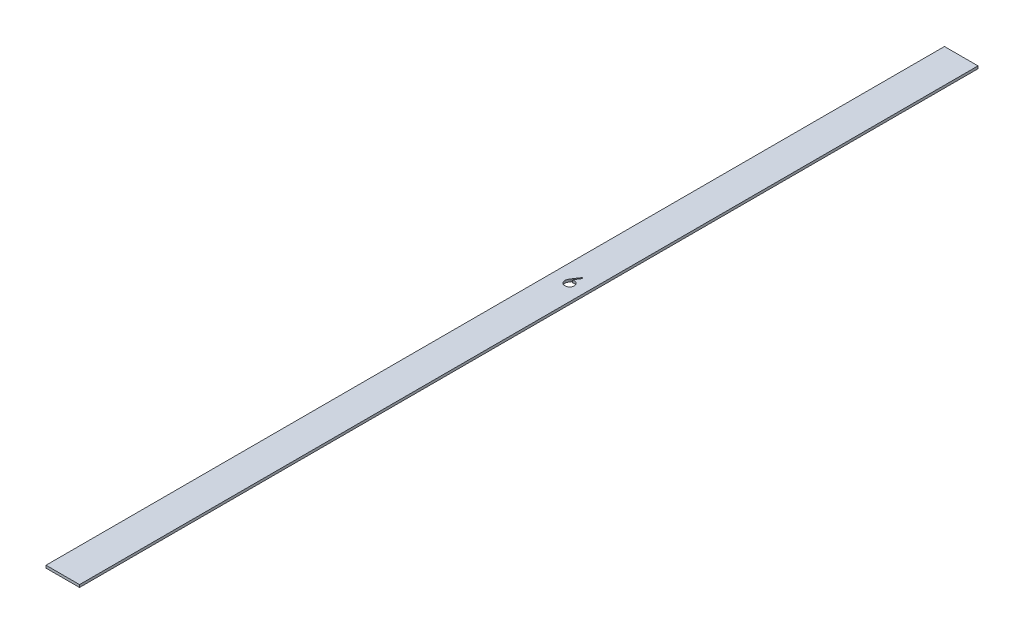
ISO-10303-21;
HEADER;
FILE_DESCRIPTION(('STEP AP214'),'2;1');
FILE_NAME('part.step','',(''),(''),'','','');
FILE_SCHEMA(('AUTOMOTIVE_DESIGN { 1 0 10303 214 1 1 1 1 }'));
ENDSEC;
DATA;
#1=APPLICATION_CONTEXT('core data for automotive mechanical design processes');
#2=APPLICATION_PROTOCOL_DEFINITION('international standard','automotive_design',2000,#1);
#3=PRODUCT_CONTEXT('',#1,'mechanical');
#4=PRODUCT('Part','Part','',(#3));
#5=PRODUCT_RELATED_PRODUCT_CATEGORY('part','',(#4));
#6=PRODUCT_DEFINITION_FORMATION('','',#4);
#7=PRODUCT_DEFINITION_CONTEXT('part definition',#1,'design');
#8=PRODUCT_DEFINITION('design','',#6,#7);
#9=PRODUCT_DEFINITION_SHAPE('','',#8);
#10=(LENGTH_UNIT() NAMED_UNIT(*) SI_UNIT(.MILLI.,.METRE.));
#11=(NAMED_UNIT(*) PLANE_ANGLE_UNIT() SI_UNIT($,.RADIAN.));
#12=(NAMED_UNIT(*) SI_UNIT($,.STERADIAN.) SOLID_ANGLE_UNIT());
#13=UNCERTAINTY_MEASURE_WITH_UNIT(LENGTH_MEASURE(1.E-05),#10,'distance_accuracy_value','');
#14=(GEOMETRIC_REPRESENTATION_CONTEXT(3) GLOBAL_UNCERTAINTY_ASSIGNED_CONTEXT((#13)) GLOBAL_UNIT_ASSIGNED_CONTEXT((#10,
#11,#12)) REPRESENTATION_CONTEXT('',''));
#15=CARTESIAN_POINT('',(0.,0.,0.));
#16=DIRECTION('',(0.,0.,1.));
#17=DIRECTION('',(1.,0.,0.));
#18=AXIS2_PLACEMENT_3D('',#15,#16,#17);
#19=CARTESIAN_POINT('',(24.9714082392186,-200.,-1329.57777919702));
#20=CARTESIAN_POINT('',(24.7150676256666,-200.,-1329.58609700256));
#21=CARTESIAN_POINT('',(24.2073017519402,-200.,-1329.60257311902));
#22=CARTESIAN_POINT('',(23.4603632575903,-200.,-1329.74934486659));
#23=CARTESIAN_POINT('',(22.7426516917751,-200.,-1329.98723638309));
#24=CARTESIAN_POINT('',(22.0591954899762,-200.,-1330.31497409916));
#25=CARTESIAN_POINT('',(21.42607901104,-200.,-1330.72894629066));
#26=CARTESIAN_POINT('',(20.859664618457,-200.,-1331.22730669565));
#27=CARTESIAN_POINT('',(20.3627765312167,-200.,-1331.7994024984));
#28=CARTESIAN_POINT('',(19.9492575230081,-200.,-1332.44514495998));
#29=CARTESIAN_POINT('',(19.6212778534097,-200.,-1333.13905458583));
#30=CARTESIAN_POINT('',(19.3753155467053,-200.,-1333.86261253703));
#31=CARTESIAN_POINT('',(19.2316445656685,-200.,-1334.61318243757));
#32=CARTESIAN_POINT('',(19.2115682776947,-200.,-1335.12198692371));
#33=CARTESIAN_POINT('',(19.2014563161417,-200.,-1335.37825996625));
#34=B_SPLINE_CURVE_WITH_KNOTS('',3,(#19,#20,#21,#22,#23,#24,#25,#26,#27,#28,#29,#30,#31,#32,
#33),.UNSPECIFIED.,.F.,.F.,(4,1,1,1,1,1,1,1,1,1,1,1,4),(0.,0.084334721992627,0.167052318416074,
0.249566077240966,0.332740481801847,0.415914886362728,0.497828009539996,0.580372588608052,
0.664600121056504,0.749466693112618,0.832510233940141,0.915639281668174,1.),.UNSPECIFIED.);
#35=DIRECTION('',(0.,1.,0.));
#36=VECTOR('',#35,1.);
#37=SURFACE_OF_LINEAR_EXTRUSION('',#34,#36);
#38=DIRECTION('',(0.,-1.,0.));
#39=VECTOR('',#38,1.);
#40=CARTESIAN_POINT('',(19.2014563161417,-200.,-1335.37825996625));
#41=LINE('',#40,#39);
#42=CARTESIAN_POINT('',(19.2014563161417,-196.825,-1335.37825996625));
#43=VERTEX_POINT('',#42);
#44=CARTESIAN_POINT('',(19.2014563161417,-200.,-1335.37825996625));
#45=VERTEX_POINT('',#44);
#46=EDGE_CURVE('E219',#43,#45,#41,.T.);
#47=ORIENTED_EDGE('',*,*,#46,.F.);
#48=CARTESIAN_POINT('',(24.9714082392186,-196.825,-1329.57777919702));
#49=CARTESIAN_POINT('',(24.7150676256666,-196.825,-1329.58609700256));
#50=CARTESIAN_POINT('',(24.2073017519402,-196.825,-1329.60257311902));
#51=CARTESIAN_POINT('',(23.4603632575903,-196.825,-1329.74934486659));
#52=CARTESIAN_POINT('',(22.7426516917751,-196.825,-1329.98723638309));
#53=CARTESIAN_POINT('',(22.0591954899762,-196.825,-1330.31497409916));
#54=CARTESIAN_POINT('',(21.42607901104,-196.825,-1330.72894629066));
#55=CARTESIAN_POINT('',(20.859664618457,-196.825,-1331.22730669565));
#56=CARTESIAN_POINT('',(20.3627765312167,-196.825,-1331.7994024984));
#57=CARTESIAN_POINT('',(19.9492575230081,-196.825,-1332.44514495998));
#58=CARTESIAN_POINT('',(19.6212778534097,-196.825,-1333.13905458583));
#59=CARTESIAN_POINT('',(19.3753155467053,-196.825,-1333.86261253703));
#60=CARTESIAN_POINT('',(19.2316445656685,-196.825,-1334.61318243757));
#61=CARTESIAN_POINT('',(19.2115682776947,-196.825,-1335.12198692371));
#62=CARTESIAN_POINT('',(19.2014563161417,-196.825,-1335.37825996625));
#63=B_SPLINE_CURVE_WITH_KNOTS('',3,(#48,#49,#50,#51,#52,#53,#54,#55,#56,#57,#58,#59,#60,#61,
#62),.UNSPECIFIED.,.F.,.F.,(4,1,1,1,1,1,1,1,1,1,1,1,4),(0.,0.084334721992627,0.167052318416074,
0.249566077240966,0.332740481801847,0.415914886362728,0.497828009539996,0.580372588608052,
0.664600121056504,0.749466693112618,0.832510233940141,0.915639281668174,1.),.UNSPECIFIED.);
#64=CARTESIAN_POINT('',(24.9714082392186,-196.825,-1329.57777919702));
#65=VERTEX_POINT('',#64);
#66=EDGE_CURVE('E131',#65,#43,#63,.T.);
#67=ORIENTED_EDGE('',*,*,#66,.F.);
#68=DIRECTION('',(0.,-1.,0.));
#69=VECTOR('',#68,1.);
#70=CARTESIAN_POINT('',(24.9714082392186,-200.,-1329.57777919702));
#71=LINE('',#70,#69);
#72=CARTESIAN_POINT('',(24.9714082392186,-200.,-1329.57777919702));
#73=VERTEX_POINT('',#72);
#74=EDGE_CURVE('E215',#65,#73,#71,.T.);
#75=ORIENTED_EDGE('',*,*,#74,.T.);
#76=EDGE_CURVE('E288',#73,#45,#34,.T.);
#77=ORIENTED_EDGE('',*,*,#76,.T.);
#78=EDGE_LOOP('',(#47,#67,#75,#77));
#79=FACE_BOUND('',#78,.T.);
#80=ADVANCED_FACE('F48',(#79),#37,.T.);
#81=CARTESIAN_POINT('',(30.9245332392186,-200.,-1335.41260491817));
#82=CARTESIAN_POINT('',(30.9167874826346,-200.,-1335.14601538669));
#83=CARTESIAN_POINT('',(30.9015456667687,-200.,-1334.62143027915));
#84=CARTESIAN_POINT('',(30.7496692912848,-200.,-1333.85737992));
#85=CARTESIAN_POINT('',(30.5136689391165,-200.,-1333.1294929426));
#86=CARTESIAN_POINT('',(30.1763341059508,-200.,-1332.4493906813));
#87=CARTESIAN_POINT('',(29.7573299928536,-200.,-1331.81800526688));
#88=CARTESIAN_POINT('',(29.2463676670475,-200.,-1331.25855866223));
#89=CARTESIAN_POINT('',(28.6615681091149,-200.,-1330.75961174483));
#90=CARTESIAN_POINT('',(28.0003328218781,-200.,-1330.34238071742));
#91=CARTESIAN_POINT('',(27.2887175457591,-200.,-1330.00164125406));
#92=CARTESIAN_POINT('',(26.5411302455468,-200.,-1329.75690186501));
#93=CARTESIAN_POINT('',(25.7648310633292,-200.,-1329.60622469589));
#94=CARTESIAN_POINT('',(25.2379374109179,-200.,-1329.58733470137));
#95=CARTESIAN_POINT('',(24.9714082392186,-200.,-1329.57777919702));
#96=B_SPLINE_CURVE_WITH_KNOTS('',3,(#81,#82,#83,#84,#85,#86,#87,#88,#89,#90,#91,#92,#93,#94,
#95),.UNSPECIFIED.,.F.,.F.,(4,1,1,1,1,1,1,1,1,1,1,1,4),(0.,0.085947943144129,0.169125211880691,
0.250399107186049,0.332289736138836,0.413364287915881,0.494172283371189,0.576021735386637,
0.660756969254007,0.745783125913744,0.830043592975224,0.914027545820683,1.),.UNSPECIFIED.);
#97=DIRECTION('',(0.,1.,0.));
#98=VECTOR('',#97,1.);
#99=SURFACE_OF_LINEAR_EXTRUSION('',#96,#98);
#100=ORIENTED_EDGE('',*,*,#74,.F.);
#101=CARTESIAN_POINT('',(30.9245332392186,-196.825,-1335.41260491817));
#102=CARTESIAN_POINT('',(30.9167874826346,-196.825,-1335.14601538669));
#103=CARTESIAN_POINT('',(30.9015456667687,-196.825,-1334.62143027915));
#104=CARTESIAN_POINT('',(30.7496692912848,-196.825,-1333.85737992));
#105=CARTESIAN_POINT('',(30.5136689391165,-196.825,-1333.1294929426));
#106=CARTESIAN_POINT('',(30.1763341059508,-196.825,-1332.4493906813));
#107=CARTESIAN_POINT('',(29.7573299928536,-196.825,-1331.81800526688));
#108=CARTESIAN_POINT('',(29.2463676670475,-196.825,-1331.25855866223));
#109=CARTESIAN_POINT('',(28.6615681091149,-196.825,-1330.75961174483));
#110=CARTESIAN_POINT('',(28.0003328218781,-196.825,-1330.34238071742));
#111=CARTESIAN_POINT('',(27.2887175457591,-196.825,-1330.00164125406));
#112=CARTESIAN_POINT('',(26.5411302455468,-196.825,-1329.75690186501));
#113=CARTESIAN_POINT('',(25.7648310633292,-196.825,-1329.60622469589));
#114=CARTESIAN_POINT('',(25.2379374109179,-196.825,-1329.58733470137));
#115=CARTESIAN_POINT('',(24.9714082392186,-196.825,-1329.57777919702));
#116=B_SPLINE_CURVE_WITH_KNOTS('',3,(#101,#102,#103,#104,#105,#106,#107,#108,#109,#110,#111,
#112,#113,#114,#115),.UNSPECIFIED.,.F.,.F.,(4,1,1,1,1,1,1,1,1,1,1,1,4),(0.,0.085947943144129,
0.169125211880691,0.250399107186049,0.332289736138836,0.413364287915881,0.494172283371189,
0.576021735386637,0.660756969254007,0.745783125913744,0.830043592975224,0.914027545820683,1.),.UNSPECIFIED.);
#117=CARTESIAN_POINT('',(30.9245332392186,-196.825,-1335.41260491817));
#118=VERTEX_POINT('',#117);
#119=EDGE_CURVE('E167',#118,#65,#116,.T.);
#120=ORIENTED_EDGE('',*,*,#119,.F.);
#121=DIRECTION('',(0.,-1.,0.));
#122=VECTOR('',#121,1.);
#123=CARTESIAN_POINT('',(30.9245332392186,-200.,-1335.41260491817));
#124=LINE('',#123,#122);
#125=CARTESIAN_POINT('',(30.9245332392186,-200.,-1335.41260491817));
#126=VERTEX_POINT('',#125);
#127=EDGE_CURVE('E211',#118,#126,#124,.T.);
#128=ORIENTED_EDGE('',*,*,#127,.T.);
#129=EDGE_CURVE('E282',#126,#73,#96,.T.);
#130=ORIENTED_EDGE('',*,*,#129,.T.);
#131=EDGE_LOOP('',(#100,#120,#128,#130));
#132=FACE_BOUND('',#131,.T.);
#133=ADVANCED_FACE('F277',(#132),#99,.T.);
#134=CARTESIAN_POINT('',(25.2728805949879,-200.,-1341.05662535086));
#135=CARTESIAN_POINT('',(25.466496610755,-200.,-1341.05142137149));
#136=CARTESIAN_POINT('',(25.8476239760938,-200.,-1341.04117749296));
#137=CARTESIAN_POINT('',(26.4071867136408,-200.,-1340.96234396276));
#138=CARTESIAN_POINT('',(26.9448807794377,-200.,-1340.83811013929));
#139=CARTESIAN_POINT('',(27.4584775547135,-200.,-1340.65701400335));
#140=CARTESIAN_POINT('',(27.9498204988349,-200.,-1340.42567976032));
#141=CARTESIAN_POINT('',(28.4217292547971,-200.,-1340.14842676636));
#142=CARTESIAN_POINT('',(28.8653330526609,-200.,-1339.81093870613));
#143=CARTESIAN_POINT('',(29.2863444709428,-200.,-1339.4339394468));
#144=CARTESIAN_POINT('',(29.6685805296102,-200.,-1339.01637985976));
#145=CARTESIAN_POINT('',(30.0069959177161,-200.,-1338.57332401283));
#146=CARTESIAN_POINT('',(30.2912588841547,-200.,-1338.1052335034));
#147=CARTESIAN_POINT('',(30.5218940860855,-200.,-1337.61234541882));
#148=CARTESIAN_POINT('',(30.7009906395968,-200.,-1337.09541953464));
#149=CARTESIAN_POINT('',(30.8315519647627,-200.,-1336.55511723256));
#150=CARTESIAN_POINT('',(30.908729462825,-200.,-1335.9910659379));
#151=CARTESIAN_POINT('',(30.9192096337171,-200.,-1335.60746329824));
#152=CARTESIAN_POINT('',(30.9245332392186,-200.,-1335.41260491817));
#153=B_SPLINE_CURVE_WITH_KNOTS('',3,(#134,#135,#136,#137,#138,#139,#140,#141,#142,#143,#144,
#145,#146,#147,#148,#149,#150,#151,#152),.UNSPECIFIED.,.F.,.F.,(4,1,1,1,1,1,1,1,1,1,1,1,1,1,1,1,
4),(0.,0.0652308037420294,0.128404896003223,0.190067071596478,0.25094336576828,
0.311545832852143,0.37286280215683,0.435023673856238,0.499071724707044,0.563091075049662,
0.625510106330375,0.686680035929649,0.747282503013513,0.808563495215959,0.870742103515987,
0.934340951505912,1.),.UNSPECIFIED.);
#154=DIRECTION('',(0.,1.,0.));
#155=VECTOR('',#154,1.);
#156=SURFACE_OF_LINEAR_EXTRUSION('',#153,#155);
#157=ORIENTED_EDGE('',*,*,#127,.F.);
#158=CARTESIAN_POINT('',(25.2728805949879,-196.825,-1341.05662535086));
#159=CARTESIAN_POINT('',(25.466496610755,-196.825,-1341.05142137149));
#160=CARTESIAN_POINT('',(25.8476239760938,-196.825,-1341.04117749296));
#161=CARTESIAN_POINT('',(26.4071867136408,-196.825,-1340.96234396276));
#162=CARTESIAN_POINT('',(26.9448807794377,-196.825,-1340.83811013929));
#163=CARTESIAN_POINT('',(27.4584775547135,-196.825,-1340.65701400335));
#164=CARTESIAN_POINT('',(27.9498204988349,-196.825,-1340.42567976032));
#165=CARTESIAN_POINT('',(28.4217292547971,-196.825,-1340.14842676636));
#166=CARTESIAN_POINT('',(28.8653330526609,-196.825,-1339.81093870613));
#167=CARTESIAN_POINT('',(29.2863444709428,-196.825,-1339.4339394468));
#168=CARTESIAN_POINT('',(29.6685805296102,-196.825,-1339.01637985976));
#169=CARTESIAN_POINT('',(30.0069959177161,-196.825,-1338.57332401283));
#170=CARTESIAN_POINT('',(30.2912588841547,-196.825,-1338.1052335034));
#171=CARTESIAN_POINT('',(30.5218940860855,-196.825,-1337.61234541882));
#172=CARTESIAN_POINT('',(30.7009906395968,-196.825,-1337.09541953464));
#173=CARTESIAN_POINT('',(30.8315519647627,-196.825,-1336.55511723256));
#174=CARTESIAN_POINT('',(30.908729462825,-196.825,-1335.9910659379));
#175=CARTESIAN_POINT('',(30.9192096337171,-196.825,-1335.60746329824));
#176=CARTESIAN_POINT('',(30.9245332392186,-196.825,-1335.41260491817));
#177=B_SPLINE_CURVE_WITH_KNOTS('',3,(#158,#159,#160,#161,#162,#163,#164,#165,#166,#167,#168,
#169,#170,#171,#172,#173,#174,#175,#176),.UNSPECIFIED.,.F.,.F.,(4,1,1,1,1,1,1,1,1,1,1,1,1,1,1,1,
4),(0.,0.0652308037420294,0.128404896003223,0.190067071596478,0.25094336576828,
0.311545832852143,0.37286280215683,0.435023673856238,0.499071724707044,0.563091075049662,
0.625510106330375,0.686680035929649,0.747282503013513,0.808563495215959,0.870742103515987,
0.934340951505912,1.),.UNSPECIFIED.);
#178=CARTESIAN_POINT('',(25.2728805949879,-196.825,-1341.05662535086));
#179=VERTEX_POINT('',#178);
#180=EDGE_CURVE('E158',#179,#118,#177,.T.);
#181=ORIENTED_EDGE('',*,*,#180,.F.);
#182=DIRECTION('',(0.,-1.,0.));
#183=VECTOR('',#182,1.);
#184=CARTESIAN_POINT('',(25.2728805949879,-200.,-1341.05662535086));
#185=LINE('',#184,#183);
#186=CARTESIAN_POINT('',(25.2728805949879,-200.,-1341.05662535086));
#187=VERTEX_POINT('',#186);
#188=EDGE_CURVE('E207',#179,#187,#185,.T.);
#189=ORIENTED_EDGE('',*,*,#188,.T.);
#190=EDGE_CURVE('E258',#187,#126,#153,.T.);
#191=ORIENTED_EDGE('',*,*,#190,.T.);
#192=EDGE_LOOP('',(#157,#181,#189,#191));
#193=FACE_BOUND('',#192,.T.);
#194=ADVANCED_FACE('F272',(#193),#156,.T.);
#195=CARTESIAN_POINT('',(23.2999539122956,-200.,-1340.87345227394));
#196=CARTESIAN_POINT('',(23.635072134162,-200.,-1340.9268677155));
#197=CARTESIAN_POINT('',(24.2887581164709,-200.,-1341.03106057374));
#198=CARTESIAN_POINT('',(24.9504239355822,-200.,-1341.04824881968));
#199=CARTESIAN_POINT('',(25.2728805949879,-200.,-1341.05662535086));
#200=B_SPLINE_CURVE_WITH_KNOTS('',3,(#195,#196,#197,#198,#199),.UNSPECIFIED.,.F.,.F.,(4,1,4),
(0.,0.512659336341781,1.),.UNSPECIFIED.);
#201=DIRECTION('',(0.,1.,0.));
#202=VECTOR('',#201,1.);
#203=SURFACE_OF_LINEAR_EXTRUSION('',#200,#202);
#204=ORIENTED_EDGE('',*,*,#188,.F.);
#205=CARTESIAN_POINT('',(23.2999539122956,-196.825,-1340.87345227394));
#206=CARTESIAN_POINT('',(23.635072134162,-196.825,-1340.9268677155));
#207=CARTESIAN_POINT('',(24.2887581164709,-196.825,-1341.03106057374));
#208=CARTESIAN_POINT('',(24.9504239355822,-196.825,-1341.04824881968));
#209=CARTESIAN_POINT('',(25.2728805949879,-196.825,-1341.05662535086));
#210=B_SPLINE_CURVE_WITH_KNOTS('',3,(#205,#206,#207,#208,#209),.UNSPECIFIED.,.F.,.F.,(4,1,4),
(0.,0.512659336341781,1.),.UNSPECIFIED.);
#211=CARTESIAN_POINT('',(23.2999539122956,-196.825,-1340.87345227394));
#212=VERTEX_POINT('',#211);
#213=EDGE_CURVE('E152',#212,#179,#210,.T.);
#214=ORIENTED_EDGE('',*,*,#213,.F.);
#215=DIRECTION('',(0.,-1.,0.));
#216=VECTOR('',#215,1.);
#217=CARTESIAN_POINT('',(23.2999539122956,-200.,-1340.87345227394));
#218=LINE('',#217,#216);
#219=CARTESIAN_POINT('',(23.2999539122956,-200.,-1340.87345227394));
#220=VERTEX_POINT('',#219);
#221=EDGE_CURVE('E203',#212,#220,#218,.T.);
#222=ORIENTED_EDGE('',*,*,#221,.T.);
#223=EDGE_CURVE('E251',#220,#187,#200,.T.);
#224=ORIENTED_EDGE('',*,*,#223,.T.);
#225=EDGE_LOOP('',(#204,#214,#222,#224));
#226=FACE_BOUND('',#225,.T.);
#227=ADVANCED_FACE('F267',(#226),#203,.T.);
#228=CARTESIAN_POINT('',(28.333397421911,-200.,-1348.57053761048));
#229=DIRECTION('',(-0.836933063027773,0.,-0.547305260353809));
#230=DIRECTION('',(-0.547305260353809,0.,0.836933063027773));
#231=AXIS2_PLACEMENT_3D('',#228,#229,#230);
#232=PLANE('',#231);
#233=ORIENTED_EDGE('',*,*,#221,.F.);
#234=DIRECTION('',(-0.547305260353809,0.,0.836933063027773));
#235=VECTOR('',#234,1.);
#236=CARTESIAN_POINT('',(28.333397421911,-196.825,-1348.57053761048));
#237=LINE('',#236,#235);
#238=CARTESIAN_POINT('',(28.333397421911,-196.825,-1348.57053761048));
#239=VERTEX_POINT('',#238);
#240=EDGE_CURVE('E148',#239,#212,#237,.T.);
#241=ORIENTED_EDGE('',*,*,#240,.F.);
#242=DIRECTION('',(0.,-1.,0.));
#243=VECTOR('',#242,1.);
#244=CARTESIAN_POINT('',(28.333397421911,-200.,-1348.57053761048));
#245=LINE('',#244,#243);
#246=CARTESIAN_POINT('',(28.333397421911,-200.,-1348.57053761048));
#247=VERTEX_POINT('',#246);
#248=EDGE_CURVE('E200',#239,#247,#245,.T.);
#249=ORIENTED_EDGE('',*,*,#248,.T.);
#250=DIRECTION('',(-0.547305260353809,0.,0.836933063027773));
#251=VECTOR('',#250,1.);
#252=CARTESIAN_POINT('',(28.333397421911,-200.,-1348.57053761048));
#253=LINE('',#252,#251);
#254=EDGE_CURVE('E247',#247,#220,#253,.T.);
#255=ORIENTED_EDGE('',*,*,#254,.T.);
#256=EDGE_LOOP('',(#233,#241,#249,#255));
#257=FACE_BOUND('',#256,.T.);
#258=ADVANCED_FACE('F271',(#257),#232,.T.);
#259=CARTESIAN_POINT('',(27.0168409315263,-200.,-1349.60470227394));
#260=DIRECTION('',(-0.617720878793949,0.,0.786397428722928));
#261=DIRECTION('',(0.786397428722928,0.,0.617720878793949));
#262=AXIS2_PLACEMENT_3D('',#259,#260,#261);
#263=PLANE('',#262);
#264=ORIENTED_EDGE('',*,*,#248,.F.);
#265=DIRECTION('',(0.786397428722928,0.,0.617720878793949));
#266=VECTOR('',#265,1.);
#267=CARTESIAN_POINT('',(27.0168409315263,-196.825,-1349.60470227394));
#268=LINE('',#267,#266);
#269=CARTESIAN_POINT('',(27.0168409315263,-196.825,-1349.60470227394));
#270=VERTEX_POINT('',#269);
#271=EDGE_CURVE('E144',#270,#239,#268,.T.);
#272=ORIENTED_EDGE('',*,*,#271,.F.);
#273=DIRECTION('',(0.,-1.,0.));
#274=VECTOR('',#273,1.);
#275=CARTESIAN_POINT('',(27.0168409315263,-200.,-1349.60470227394));
#276=LINE('',#275,#274);
#277=CARTESIAN_POINT('',(27.0168409315263,-200.,-1349.60470227394));
#278=VERTEX_POINT('',#277);
#279=EDGE_CURVE('E74',#270,#278,#276,.T.);
#280=ORIENTED_EDGE('',*,*,#279,.T.);
#281=DIRECTION('',(0.786397428722928,0.,0.617720878793949));
#282=VECTOR('',#281,1.);
#283=CARTESIAN_POINT('',(27.0168409315263,-200.,-1349.60470227394));
#284=LINE('',#283,#282);
#285=EDGE_CURVE('E197',#278,#247,#284,.T.);
#286=ORIENTED_EDGE('',*,*,#285,.T.);
#287=EDGE_LOOP('',(#264,#272,#280,#286));
#288=FACE_BOUND('',#287,.T.);
#289=ADVANCED_FACE('F358',(#288),#263,.T.);
#290=CARTESIAN_POINT('',(21.3308433353725,-200.,-1340.91161333163));
#291=DIRECTION('',(0.836878996160949,0.,0.547387929885783));
#292=DIRECTION('',(0.547387929885783,0.,-0.836878996160948));
#293=AXIS2_PLACEMENT_3D('',#290,#291,#292);
#294=PLANE('',#293);
#295=ORIENTED_EDGE('',*,*,#279,.F.);
#296=DIRECTION('',(0.547387929885783,0.,-0.836878996160948));
#297=VECTOR('',#296,1.);
#298=CARTESIAN_POINT('',(21.3308433353725,-196.825,-1340.91161333163));
#299=LINE('',#298,#297);
#300=CARTESIAN_POINT('',(21.3308433353725,-196.825,-1340.91161333163));
#301=VERTEX_POINT('',#300);
#302=EDGE_CURVE('E128',#301,#270,#299,.T.);
#303=ORIENTED_EDGE('',*,*,#302,.F.);
#304=DIRECTION('',(0.,-1.,0.));
#305=VECTOR('',#304,1.);
#306=CARTESIAN_POINT('',(21.3308433353725,-200.,-1340.91161333163));
#307=LINE('',#306,#305);
#308=CARTESIAN_POINT('',(21.3308433353725,-200.,-1340.91161333163));
#309=VERTEX_POINT('',#308);
#310=EDGE_CURVE('E111',#301,#309,#307,.T.);
#311=ORIENTED_EDGE('',*,*,#310,.T.);
#312=DIRECTION('',(0.547387929885783,0.,-0.836878996160948));
#313=VECTOR('',#312,1.);
#314=CARTESIAN_POINT('',(21.3308433353725,-200.,-1340.91161333163));
#315=LINE('',#314,#313);
#316=EDGE_CURVE('E305',#309,#278,#315,.T.);
#317=ORIENTED_EDGE('',*,*,#316,.T.);
#318=EDGE_LOOP('',(#295,#303,#311,#317));
#319=FACE_BOUND('',#318,.T.);
#320=ADVANCED_FACE('F134',(#319),#294,.T.);
#321=CARTESIAN_POINT('',(48.35,-200.,-701.675));
#322=DIRECTION('',(0.,0.,1.));
#323=DIRECTION('',(1.,0.,0.));
#324=AXIS2_PLACEMENT_3D('',#321,#322,#323);
#325=PLANE('',#324);
#326=DIRECTION('',(0.,1.,0.));
#327=VECTOR('',#326,1.);
#328=CARTESIAN_POINT('',(45.1750000000001,-200.,-701.675));
#329=LINE('',#328,#327);
#330=CARTESIAN_POINT('',(45.1750000000001,-200.,-701.675));
#331=VERTEX_POINT('',#330);
#332=CARTESIAN_POINT('',(45.1750000000001,-196.825,-701.675));
#333=VERTEX_POINT('',#332);
#334=EDGE_CURVE('E239',#331,#333,#329,.T.);
#335=ORIENTED_EDGE('',*,*,#334,.T.);
#336=DIRECTION('',(-1.,0.,0.));
#337=VECTOR('',#336,1.);
#338=CARTESIAN_POINT('',(48.35,-196.825,-701.675));
#339=LINE('',#338,#337);
#340=CARTESIAN_POINT('',(3.17499999999988,-196.825,-701.675));
#341=VERTEX_POINT('',#340);
#342=EDGE_CURVE('E136',#341,#333,#339,.F.);
#343=ORIENTED_EDGE('',*,*,#342,.F.);
#344=DIRECTION('',(0.,1.,0.));
#345=VECTOR('',#344,1.);
#346=CARTESIAN_POINT('',(3.17499999999988,-200.,-701.675));
#347=LINE('',#346,#345);
#348=CARTESIAN_POINT('',(3.17499999999988,-200.,-701.675));
#349=VERTEX_POINT('',#348);
#350=EDGE_CURVE('E65',#349,#341,#347,.T.);
#351=ORIENTED_EDGE('',*,*,#350,.F.);
#352=DIRECTION('',(1.,0.,0.));
#353=VECTOR('',#352,1.);
#354=CARTESIAN_POINT('',(48.35,-200.,-701.675));
#355=LINE('',#354,#353);
#356=EDGE_CURVE('E311',#349,#331,#355,.T.);
#357=ORIENTED_EDGE('',*,*,#356,.T.);
#358=EDGE_LOOP('',(#335,#343,#351,#357));
#359=FACE_BOUND('',#358,.T.);
#360=ADVANCED_FACE('F335',(#359),#325,.T.);
#361=CARTESIAN_POINT('',(100.,-200.,-1826.81834907142));
#362=DIRECTION('',(0.,0.,-1.));
#363=DIRECTION('',(-1.,0.,0.));
#364=AXIS2_PLACEMENT_3D('',#361,#362,#363);
#365=PLANE('',#364);
#366=DIRECTION('',(0.,-1.,0.));
#367=VECTOR('',#366,1.);
#368=CARTESIAN_POINT('',(3.17500000000003,-200.,-1826.81834907142));
#369=LINE('',#368,#367);
#370=CARTESIAN_POINT('',(3.17500000000002,-196.825,-1826.81834907142));
#371=VERTEX_POINT('',#370);
#372=CARTESIAN_POINT('',(3.17500000000002,-200.,-1826.81834907142));
#373=VERTEX_POINT('',#372);
#374=EDGE_CURVE('E121',#371,#373,#369,.T.);
#375=ORIENTED_EDGE('',*,*,#374,.F.);
#376=DIRECTION('',(-1.,0.,0.));
#377=VECTOR('',#376,1.);
#378=CARTESIAN_POINT('',(48.35,-196.825,-1826.81834907142));
#379=LINE('',#378,#377);
#380=CARTESIAN_POINT('',(45.175,-196.825,-1826.81834907142));
#381=VERTEX_POINT('',#380);
#382=EDGE_CURVE('E140',#381,#371,#379,.T.);
#383=ORIENTED_EDGE('',*,*,#382,.F.);
#384=DIRECTION('',(0.,-1.,0.));
#385=VECTOR('',#384,1.);
#386=CARTESIAN_POINT('',(45.175,-200.,-1826.81834907142));
#387=LINE('',#386,#385);
#388=CARTESIAN_POINT('',(45.175,-200.,-1826.81834907142));
#389=VERTEX_POINT('',#388);
#390=EDGE_CURVE('E193',#381,#389,#387,.T.);
#391=ORIENTED_EDGE('',*,*,#390,.T.);
#392=DIRECTION('',(-1.,0.,0.));
#393=VECTOR('',#392,1.);
#394=CARTESIAN_POINT('',(100.,-200.,-1826.81834907142));
#395=LINE('',#394,#393);
#396=EDGE_CURVE('E147',#389,#373,#395,.T.);
#397=ORIENTED_EDGE('',*,*,#396,.T.);
#398=EDGE_LOOP('',(#375,#383,#391,#397));
#399=FACE_BOUND('',#398,.T.);
#400=ADVANCED_FACE('F235',(#399),#365,.T.);
#401=CARTESIAN_POINT('',(19.2014563161417,-200.,-1335.37825996625));
#402=CARTESIAN_POINT('',(19.2078867525346,-200.,-1335.57444548343));
#403=CARTESIAN_POINT('',(19.221016475007,-200.,-1335.97501882502));
#404=CARTESIAN_POINT('',(19.31269264242,-200.,-1336.58170160568));
#405=CARTESIAN_POINT('',(19.4600024540262,-200.,-1337.20246535051));
#406=CARTESIAN_POINT('',(19.6249767948874,-200.,-1337.72908460423));
#407=CARTESIAN_POINT('',(19.7992876152757,-200.,-1338.16049374518));
#408=CARTESIAN_POINT('',(19.9443535807453,-200.,-1338.50831131557));
#409=CARTESIAN_POINT('',(20.1249149020515,-200.,-1338.86623944275));
#410=CARTESIAN_POINT('',(20.3174471625559,-200.,-1339.24655166145));
#411=CARTESIAN_POINT('',(20.5392809776472,-200.,-1339.63944665936));
#412=CARTESIAN_POINT('',(20.7804847264609,-200.,-1340.05149091743));
#413=CARTESIAN_POINT('',(21.0477271121039,-200.,-1340.47613135228));
#414=CARTESIAN_POINT('',(21.2350711407645,-200.,-1340.76429904355));
#415=CARTESIAN_POINT('',(21.3308433353725,-200.,-1340.91161333163));
#416=B_SPLINE_CURVE_WITH_KNOTS('',3,(#401,#402,#403,#404,#405,#406,#407,#408,#409,#410,#411,
#412,#413,#414,#415),.UNSPECIFIED.,.F.,.F.,(4,1,1,1,1,1,1,1,1,1,1,1,4),(0.,0.0978181896147143,
0.199726053401827,0.30527635747794,0.415811490538293,0.474472231143561,0.537273879776098,
0.603657420559658,0.674298863090126,0.74983448531623,0.828598476757101,0.912377778157781,1.),.UNSPECIFIED.);
#417=DIRECTION('',(0.,1.,0.));
#418=VECTOR('',#417,1.);
#419=SURFACE_OF_LINEAR_EXTRUSION('',#416,#418);
#420=CARTESIAN_POINT('',(19.2014563161417,-196.825,-1335.37825996625));
#421=CARTESIAN_POINT('',(19.2078867525346,-196.825,-1335.57444548343));
#422=CARTESIAN_POINT('',(19.221016475007,-196.825,-1335.97501882502));
#423=CARTESIAN_POINT('',(19.31269264242,-196.825,-1336.58170160568));
#424=CARTESIAN_POINT('',(19.4600024540262,-196.825,-1337.20246535051));
#425=CARTESIAN_POINT('',(19.6249767948874,-196.825,-1337.72908460423));
#426=CARTESIAN_POINT('',(19.7992876152757,-196.825,-1338.16049374518));
#427=CARTESIAN_POINT('',(19.9443535807453,-196.825,-1338.50831131557));
#428=CARTESIAN_POINT('',(20.1249149020515,-196.825,-1338.86623944275));
#429=CARTESIAN_POINT('',(20.3174471625559,-196.825,-1339.24655166145));
#430=CARTESIAN_POINT('',(20.5392809776472,-196.825,-1339.63944665936));
#431=CARTESIAN_POINT('',(20.7804847264609,-196.825,-1340.05149091743));
#432=CARTESIAN_POINT('',(21.0477271121039,-196.825,-1340.47613135228));
#433=CARTESIAN_POINT('',(21.2350711407645,-196.825,-1340.76429904355));
#434=CARTESIAN_POINT('',(21.3308433353725,-196.825,-1340.91161333163));
#435=B_SPLINE_CURVE_WITH_KNOTS('',3,(#420,#421,#422,#423,#424,#425,#426,#427,#428,#429,#430,
#431,#432,#433,#434),.UNSPECIFIED.,.F.,.F.,(4,1,1,1,1,1,1,1,1,1,1,1,4),(0.,0.0978181896147143,
0.199726053401827,0.30527635747794,0.415811490538293,0.474472231143561,0.537273879776098,
0.603657420559658,0.674298863090126,0.74983448531623,0.828598476757101,0.912377778157781,1.),.UNSPECIFIED.);
#436=EDGE_CURVE('E114',#43,#301,#435,.T.);
#437=ORIENTED_EDGE('',*,*,#436,.F.);
#438=ORIENTED_EDGE('',*,*,#46,.T.);
#439=EDGE_CURVE('E116',#45,#309,#416,.T.);
#440=ORIENTED_EDGE('',*,*,#439,.T.);
#441=ORIENTED_EDGE('',*,*,#310,.F.);
#442=EDGE_LOOP('',(#437,#438,#440,#441));
#443=FACE_BOUND('',#442,.T.);
#444=ADVANCED_FACE('F50',(#443),#419,.T.);
#445=CARTESIAN_POINT('',(48.35,-200.,-2105.025));
#446=DIRECTION('',(0.,1.,0.));
#447=DIRECTION('',(0.,0.,-1.));
#448=AXIS2_PLACEMENT_3D('',#445,#446,#447);
#449=PLANE('',#448);
#450=ORIENTED_EDGE('',*,*,#396,.F.);
#451=DIRECTION('',(0.,0.,1.));
#452=VECTOR('',#451,1.);
#453=CARTESIAN_POINT('',(45.175,-200.,-1830.025));
#454=LINE('',#453,#452);
#455=EDGE_CURVE('E242',#389,#331,#454,.T.);
#456=ORIENTED_EDGE('',*,*,#455,.T.);
#457=ORIENTED_EDGE('',*,*,#356,.F.);
#458=DIRECTION('',(0.,0.,-1.));
#459=VECTOR('',#458,1.);
#460=CARTESIAN_POINT('',(3.17500000000002,-200.,-1830.025));
#461=LINE('',#460,#459);
#462=EDGE_CURVE('E317',#349,#373,#461,.T.);
#463=ORIENTED_EDGE('',*,*,#462,.T.);
#464=EDGE_LOOP('',(#450,#456,#457,#463));
#465=FACE_BOUND('',#464,.T.);
#466=ORIENTED_EDGE('',*,*,#316,.F.);
#467=ORIENTED_EDGE('',*,*,#439,.F.);
#468=ORIENTED_EDGE('',*,*,#76,.F.);
#469=ORIENTED_EDGE('',*,*,#129,.F.);
#470=ORIENTED_EDGE('',*,*,#190,.F.);
#471=ORIENTED_EDGE('',*,*,#223,.F.);
#472=ORIENTED_EDGE('',*,*,#254,.F.);
#473=ORIENTED_EDGE('',*,*,#285,.F.);
#474=EDGE_LOOP('',(#466,#467,#468,#469,#470,#471,#472,#473));
#475=FACE_BOUND('',#474,.T.);
#476=ADVANCED_FACE('F328',(#465,#475),#449,.F.);
#477=CARTESIAN_POINT('',(48.35,-196.825,-2105.025));
#478=DIRECTION('',(0.,1.,0.));
#479=DIRECTION('',(0.,0.,-1.));
#480=AXIS2_PLACEMENT_3D('',#477,#478,#479);
#481=PLANE('',#480);
#482=DIRECTION('',(0.,0.,1.));
#483=VECTOR('',#482,1.);
#484=CARTESIAN_POINT('',(45.175,-196.825,-2105.025));
#485=LINE('',#484,#483);
#486=EDGE_CURVE('E11',#381,#333,#485,.T.);
#487=ORIENTED_EDGE('',*,*,#486,.F.);
#488=ORIENTED_EDGE('',*,*,#382,.T.);
#489=DIRECTION('',(0.,0.,-1.));
#490=VECTOR('',#489,1.);
#491=CARTESIAN_POINT('',(3.17500000000005,-196.825,-2105.025));
#492=LINE('',#491,#490);
#493=EDGE_CURVE('E58',#341,#371,#492,.T.);
#494=ORIENTED_EDGE('',*,*,#493,.F.);
#495=ORIENTED_EDGE('',*,*,#342,.T.);
#496=EDGE_LOOP('',(#487,#488,#494,#495));
#497=FACE_BOUND('',#496,.T.);
#498=ORIENTED_EDGE('',*,*,#302,.T.);
#499=ORIENTED_EDGE('',*,*,#271,.T.);
#500=ORIENTED_EDGE('',*,*,#240,.T.);
#501=ORIENTED_EDGE('',*,*,#213,.T.);
#502=ORIENTED_EDGE('',*,*,#180,.T.);
#503=ORIENTED_EDGE('',*,*,#119,.T.);
#504=ORIENTED_EDGE('',*,*,#66,.T.);
#505=ORIENTED_EDGE('',*,*,#436,.T.);
#506=EDGE_LOOP('',(#498,#499,#500,#501,#502,#503,#504,#505));
#507=FACE_BOUND('',#506,.T.);
#508=ADVANCED_FACE('F126',(#497,#507),#481,.T.);
#509=CARTESIAN_POINT('',(3.17500000000002,-200.,-1830.025));
#510=DIRECTION('',(1.,0.,0.));
#511=DIRECTION('',(0.,0.,-1.));
#512=AXIS2_PLACEMENT_3D('',#509,#510,#511);
#513=PLANE('',#512);
#514=ORIENTED_EDGE('',*,*,#374,.T.);
#515=ORIENTED_EDGE('',*,*,#462,.F.);
#516=ORIENTED_EDGE('',*,*,#350,.T.);
#517=ORIENTED_EDGE('',*,*,#493,.T.);
#518=EDGE_LOOP('',(#514,#515,#516,#517));
#519=FACE_BOUND('',#518,.T.);
#520=ADVANCED_FACE('F224',(#519),#513,.F.);
#521=CARTESIAN_POINT('',(45.175,-200.,-1830.025));
#522=DIRECTION('',(-1.,0.,0.));
#523=DIRECTION('',(0.,0.,1.));
#524=AXIS2_PLACEMENT_3D('',#521,#522,#523);
#525=PLANE('',#524);
#526=ORIENTED_EDGE('',*,*,#390,.F.);
#527=ORIENTED_EDGE('',*,*,#486,.T.);
#528=ORIENTED_EDGE('',*,*,#334,.F.);
#529=ORIENTED_EDGE('',*,*,#455,.F.);
#530=EDGE_LOOP('',(#526,#527,#528,#529));
#531=FACE_BOUND('',#530,.T.);
#532=ADVANCED_FACE('F442',(#531),#525,.F.);
#533=CLOSED_SHELL('',(#80,#133,#194,#227,#258,#289,#320,#360,#400,#444,#476,#508,#520,#532));
#534=MANIFOLD_SOLID_BREP('B2',#533);
#535=ADVANCED_BREP_SHAPE_REPRESENTATION('',(#18,#534),#14);
#536=SHAPE_DEFINITION_REPRESENTATION(#9,#535);
ENDSEC;
END-ISO-10303-21;
